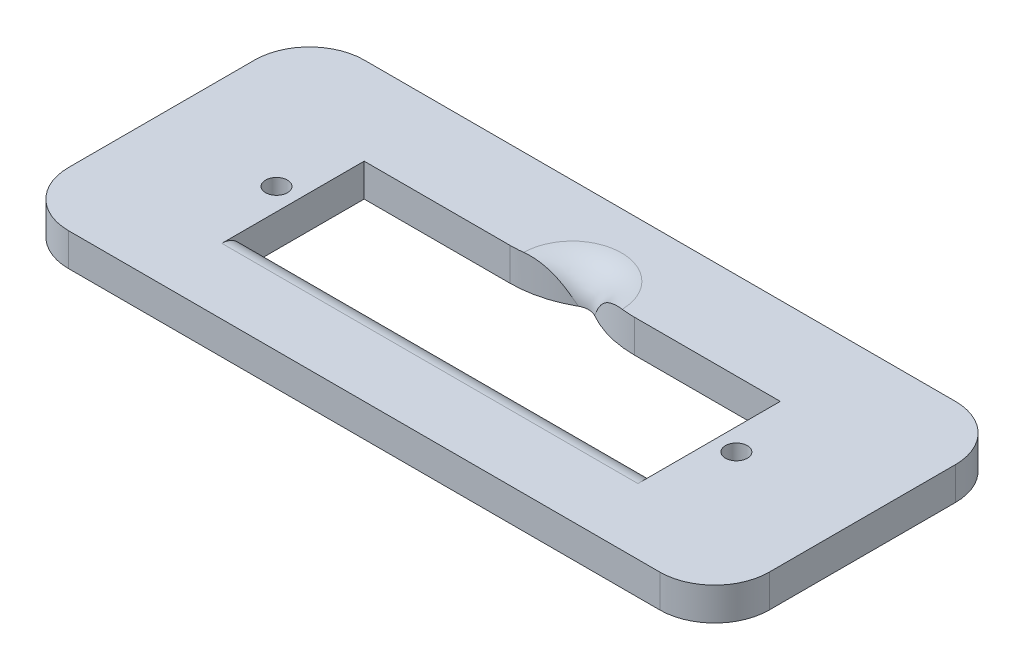
ISO-10303-21;
HEADER;
FILE_DESCRIPTION(('STEP AP214'),'2;1');
FILE_NAME('part.step','',(''),(''),'','','');
FILE_SCHEMA(('AUTOMOTIVE_DESIGN { 1 0 10303 214 1 1 1 1 }'));
ENDSEC;
DATA;
#1=APPLICATION_CONTEXT('core data for automotive mechanical design processes');
#2=APPLICATION_PROTOCOL_DEFINITION('international standard','automotive_design',2000,#1);
#3=PRODUCT_CONTEXT('',#1,'mechanical');
#4=PRODUCT('Part','Part','',(#3));
#5=PRODUCT_RELATED_PRODUCT_CATEGORY('part','',(#4));
#6=PRODUCT_DEFINITION_FORMATION('','',#4);
#7=PRODUCT_DEFINITION_CONTEXT('part definition',#1,'design');
#8=PRODUCT_DEFINITION('design','',#6,#7);
#9=PRODUCT_DEFINITION_SHAPE('','',#8);
#10=(LENGTH_UNIT() NAMED_UNIT(*) SI_UNIT(.MILLI.,.METRE.));
#11=(NAMED_UNIT(*) PLANE_ANGLE_UNIT() SI_UNIT($,.RADIAN.));
#12=(NAMED_UNIT(*) SI_UNIT($,.STERADIAN.) SOLID_ANGLE_UNIT());
#13=UNCERTAINTY_MEASURE_WITH_UNIT(LENGTH_MEASURE(1.E-05),#10,'distance_accuracy_value','');
#14=(GEOMETRIC_REPRESENTATION_CONTEXT(3) GLOBAL_UNCERTAINTY_ASSIGNED_CONTEXT((#13)) GLOBAL_UNIT_ASSIGNED_CONTEXT((#10,
#11,#12)) REPRESENTATION_CONTEXT('',''));
#15=CARTESIAN_POINT('',(0.,0.,0.));
#16=DIRECTION('',(0.,0.,1.));
#17=DIRECTION('',(1.,0.,0.));
#18=AXIS2_PLACEMENT_3D('',#15,#16,#17);
#19=CARTESIAN_POINT('',(-19.,3.,-5.5));
#20=DIRECTION('',(0.,0.,1.));
#21=DIRECTION('',(1.,0.,0.));
#22=AXIS2_PLACEMENT_3D('',#19,#20,#21);
#23=PLANE('',#22);
#24=DIRECTION('',(-1.,0.,0.));
#25=VECTOR('',#24,1.);
#26=CARTESIAN_POINT('',(-19.,3.,-5.5));
#27=LINE('',#26,#25);
#28=CARTESIAN_POINT('',(19.,3.,-5.5));
#29=VERTEX_POINT('',#28);
#30=CARTESIAN_POINT('',(5.67890834580027,3.,-5.5));
#31=VERTEX_POINT('',#30);
#32=EDGE_CURVE('E170',#29,#31,#27,.T.);
#33=ORIENTED_EDGE('',*,*,#32,.T.);
#34=DIRECTION('',(0.,-1.,0.));
#35=VECTOR('',#34,1.);
#36=CARTESIAN_POINT('',(5.67890834580027,0.,-5.5));
#37=LINE('',#36,#35);
#38=CARTESIAN_POINT('',(5.67890834580027,0.,-5.5));
#39=VERTEX_POINT('',#38);
#40=EDGE_CURVE('E299',#31,#39,#37,.T.);
#41=ORIENTED_EDGE('',*,*,#40,.T.);
#42=DIRECTION('',(-1.,0.,0.));
#43=VECTOR('',#42,1.);
#44=CARTESIAN_POINT('',(-19.,0.,-5.5));
#45=LINE('',#44,#43);
#46=CARTESIAN_POINT('',(19.,0.,-5.5));
#47=VERTEX_POINT('',#46);
#48=EDGE_CURVE('E173',#47,#39,#45,.T.);
#49=ORIENTED_EDGE('',*,*,#48,.F.);
#50=DIRECTION('',(0.,-1.,0.));
#51=VECTOR('',#50,1.);
#52=CARTESIAN_POINT('',(19.,3.,-5.5));
#53=LINE('',#52,#51);
#54=EDGE_CURVE('E160',#29,#47,#53,.T.);
#55=ORIENTED_EDGE('',*,*,#54,.F.);
#56=EDGE_LOOP('',(#33,#41,#49,#55));
#57=FACE_BOUND('',#56,.T.);
#58=ADVANCED_FACE('F38',(#57),#23,.T.);
#59=CARTESIAN_POINT('',(27.,3.,-8.5));
#60=DIRECTION('',(0.,1.,0.));
#61=DIRECTION('',(0.,0.,1.));
#62=AXIS2_PLACEMENT_3D('',#59,#60,#61);
#63=PLANE('',#62);
#64=DIRECTION('',(0.,0.,-1.));
#65=VECTOR('',#64,1.);
#66=CARTESIAN_POINT('',(19.,3.,-5.5));
#67=LINE('',#66,#65);
#68=CARTESIAN_POINT('',(19.,3.,7.5));
#69=VERTEX_POINT('',#68);
#70=EDGE_CURVE('E54',#69,#29,#67,.T.);
#71=ORIENTED_EDGE('',*,*,#70,.F.);
#72=DIRECTION('',(1.,0.,0.));
#73=VECTOR('',#72,1.);
#74=CARTESIAN_POINT('',(27.,3.,7.5));
#75=LINE('',#74,#73);
#76=CARTESIAN_POINT('',(-19.,3.,7.5));
#77=VERTEX_POINT('',#76);
#78=EDGE_CURVE('E348',#69,#77,#75,.F.);
#79=ORIENTED_EDGE('',*,*,#78,.T.);
#80=DIRECTION('',(0.,0.,1.));
#81=VECTOR('',#80,1.);
#82=CARTESIAN_POINT('',(-19.,3.,-5.5));
#83=LINE('',#82,#81);
#84=CARTESIAN_POINT('',(-19.,3.,-5.5));
#85=VERTEX_POINT('',#84);
#86=EDGE_CURVE('E61',#85,#77,#83,.T.);
#87=ORIENTED_EDGE('',*,*,#86,.F.);
#88=CARTESIAN_POINT('',(-5.67890834580028,3.,-5.5));
#89=VERTEX_POINT('',#88);
#90=EDGE_CURVE('E165',#89,#85,#27,.T.);
#91=ORIENTED_EDGE('',*,*,#90,.F.);
#92=CARTESIAN_POINT('',(-5.67890834580028,3.,-15.5));
#93=DIRECTION('',(0.,1.,0.));
#94=DIRECTION('',(0.,0.,1.));
#95=AXIS2_PLACEMENT_3D('',#92,#93,#94);
#96=CIRCLE('',#95,10.);
#97=CARTESIAN_POINT('',(-4.49945865025945,3.,-5.56979867194584));
#98=VERTEX_POINT('',#97);
#99=EDGE_CURVE('E293',#89,#98,#96,.T.);
#100=ORIENTED_EDGE('',*,*,#99,.T.);
#101=CARTESIAN_POINT('',(0.,3.,-5.5));
#102=DIRECTION('',(0.,1.,0.));
#103=DIRECTION('',(0.,0.,1.));
#104=AXIS2_PLACEMENT_3D('',#101,#102,#103);
#105=CIRCLE('',#104,4.5);
#106=CARTESIAN_POINT('',(4.49945865025945,3.,-5.56979867194584));
#107=VERTEX_POINT('',#106);
#108=EDGE_CURVE('E320',#98,#107,#105,.F.);
#109=ORIENTED_EDGE('',*,*,#108,.T.);
#110=CARTESIAN_POINT('',(5.67890834580027,3.,-15.5));
#111=DIRECTION('',(0.,1.,0.));
#112=DIRECTION('',(0.,0.,1.));
#113=AXIS2_PLACEMENT_3D('',#110,#111,#112);
#114=CIRCLE('',#113,10.);
#115=EDGE_CURVE('E181',#107,#31,#114,.T.);
#116=ORIENTED_EDGE('',*,*,#115,.T.);
#117=ORIENTED_EDGE('',*,*,#32,.F.);
#118=EDGE_LOOP('',(#71,#79,#87,#91,#100,#109,#116,#117));
#119=FACE_BOUND('',#118,.T.);
#120=CARTESIAN_POINT('',(20.994046775217,3.,0.5));
#121=DIRECTION('',(0.,1.,0.));
#122=DIRECTION('',(0.,0.,1.));
#123=AXIS2_PLACEMENT_3D('',#120,#121,#122);
#124=CIRCLE('',#123,1.);
#125=CARTESIAN_POINT('',(20.994046775217,3.,1.5));
#126=VERTEX_POINT('',#125);
#127=EDGE_CURVE('E194',#126,#126,#124,.T.);
#128=ORIENTED_EDGE('',*,*,#127,.F.);
#129=EDGE_LOOP('',(#128));
#130=FACE_BOUND('',#129,.T.);
#131=CARTESIAN_POINT('',(27.,3.,-8.5));
#132=DIRECTION('',(0.,1.,0.));
#133=DIRECTION('',(0.,0.,1.));
#134=AXIS2_PLACEMENT_3D('',#131,#132,#133);
#135=CIRCLE('',#134,5.);
#136=CARTESIAN_POINT('',(32.,3.,-8.5));
#137=VERTEX_POINT('',#136);
#138=CARTESIAN_POINT('',(27.,3.,-13.5));
#139=VERTEX_POINT('',#138);
#140=EDGE_CURVE('E212',#137,#139,#135,.T.);
#141=ORIENTED_EDGE('',*,*,#140,.T.);
#142=DIRECTION('',(-1.,0.,0.));
#143=VECTOR('',#142,1.);
#144=CARTESIAN_POINT('',(-27.,3.,-13.5));
#145=LINE('',#144,#143);
#146=CARTESIAN_POINT('',(-27.,3.,-13.5));
#147=VERTEX_POINT('',#146);
#148=EDGE_CURVE('E216',#139,#147,#145,.T.);
#149=ORIENTED_EDGE('',*,*,#148,.T.);
#150=CARTESIAN_POINT('',(-27.,3.,-8.5));
#151=DIRECTION('',(0.,1.,0.));
#152=DIRECTION('',(0.,0.,-1.));
#153=AXIS2_PLACEMENT_3D('',#150,#151,#152);
#154=CIRCLE('',#153,5.);
#155=CARTESIAN_POINT('',(-32.,3.,-8.5));
#156=VERTEX_POINT('',#155);
#157=EDGE_CURVE('E220',#147,#156,#154,.T.);
#158=ORIENTED_EDGE('',*,*,#157,.T.);
#159=DIRECTION('',(0.,0.,1.));
#160=VECTOR('',#159,1.);
#161=CARTESIAN_POINT('',(-32.,3.,-8.5));
#162=LINE('',#161,#160);
#163=CARTESIAN_POINT('',(-32.,3.,8.5));
#164=VERTEX_POINT('',#163);
#165=EDGE_CURVE('E223',#156,#164,#162,.T.);
#166=ORIENTED_EDGE('',*,*,#165,.T.);
#167=CARTESIAN_POINT('',(-27.,3.,8.5));
#168=DIRECTION('',(0.,1.,0.));
#169=DIRECTION('',(0.,0.,1.));
#170=AXIS2_PLACEMENT_3D('',#167,#168,#169);
#171=CIRCLE('',#170,5.);
#172=CARTESIAN_POINT('',(-27.,3.,13.5));
#173=VERTEX_POINT('',#172);
#174=EDGE_CURVE('E226',#164,#173,#171,.T.);
#175=ORIENTED_EDGE('',*,*,#174,.T.);
#176=DIRECTION('',(1.,0.,0.));
#177=VECTOR('',#176,1.);
#178=CARTESIAN_POINT('',(-27.,3.,13.5));
#179=LINE('',#178,#177);
#180=CARTESIAN_POINT('',(27.,3.,13.5));
#181=VERTEX_POINT('',#180);
#182=EDGE_CURVE('E229',#173,#181,#179,.T.);
#183=ORIENTED_EDGE('',*,*,#182,.T.);
#184=CARTESIAN_POINT('',(27.,3.,8.5));
#185=DIRECTION('',(0.,1.,0.));
#186=DIRECTION('',(0.,0.,1.));
#187=AXIS2_PLACEMENT_3D('',#184,#185,#186);
#188=CIRCLE('',#187,5.);
#189=CARTESIAN_POINT('',(32.,3.,8.5));
#190=VERTEX_POINT('',#189);
#191=EDGE_CURVE('E232',#181,#190,#188,.T.);
#192=ORIENTED_EDGE('',*,*,#191,.T.);
#193=DIRECTION('',(0.,0.,-1.));
#194=VECTOR('',#193,1.);
#195=CARTESIAN_POINT('',(32.,3.,-8.5));
#196=LINE('',#195,#194);
#197=EDGE_CURVE('E235',#190,#137,#196,.T.);
#198=ORIENTED_EDGE('',*,*,#197,.T.);
#199=EDGE_LOOP('',(#141,#149,#158,#166,#175,#183,#192,#198));
#200=FACE_BOUND('',#199,.T.);
#201=CARTESIAN_POINT('',(-21.005953224783,3.,0.5));
#202=DIRECTION('',(0.,1.,0.));
#203=DIRECTION('',(0.,0.,1.));
#204=AXIS2_PLACEMENT_3D('',#201,#202,#203);
#205=CIRCLE('',#204,1.);
#206=CARTESIAN_POINT('',(-21.005953224783,3.,1.5));
#207=VERTEX_POINT('',#206);
#208=EDGE_CURVE('E368',#207,#207,#205,.T.);
#209=ORIENTED_EDGE('',*,*,#208,.F.);
#210=EDGE_LOOP('',(#209));
#211=FACE_BOUND('',#210,.T.);
#212=ADVANCED_FACE('F178',(#119,#130,#200,#211),#63,.T.);
#213=CARTESIAN_POINT('',(27.,0.,-8.5));
#214=DIRECTION('',(0.,1.,0.));
#215=DIRECTION('',(0.,0.,1.));
#216=AXIS2_PLACEMENT_3D('',#213,#214,#215);
#217=PLANE('',#216);
#218=CARTESIAN_POINT('',(27.,0.,-8.5));
#219=DIRECTION('',(0.,1.,0.));
#220=DIRECTION('',(0.,0.,1.));
#221=AXIS2_PLACEMENT_3D('',#218,#219,#220);
#222=CIRCLE('',#221,5.);
#223=CARTESIAN_POINT('',(32.,0.,-8.5));
#224=VERTEX_POINT('',#223);
#225=CARTESIAN_POINT('',(27.,0.,-13.5));
#226=VERTEX_POINT('',#225);
#227=EDGE_CURVE('E175',#224,#226,#222,.T.);
#228=ORIENTED_EDGE('',*,*,#227,.F.);
#229=DIRECTION('',(0.,0.,-1.));
#230=VECTOR('',#229,1.);
#231=CARTESIAN_POINT('',(32.,0.,-8.5));
#232=LINE('',#231,#230);
#233=CARTESIAN_POINT('',(32.,0.,8.5));
#234=VERTEX_POINT('',#233);
#235=EDGE_CURVE('E217',#234,#224,#232,.T.);
#236=ORIENTED_EDGE('',*,*,#235,.F.);
#237=CARTESIAN_POINT('',(27.,0.,8.5));
#238=DIRECTION('',(0.,1.,0.));
#239=DIRECTION('',(0.,0.,1.));
#240=AXIS2_PLACEMENT_3D('',#237,#238,#239);
#241=CIRCLE('',#240,5.);
#242=CARTESIAN_POINT('',(27.,0.,13.5));
#243=VERTEX_POINT('',#242);
#244=EDGE_CURVE('E257',#243,#234,#241,.T.);
#245=ORIENTED_EDGE('',*,*,#244,.F.);
#246=DIRECTION('',(1.,0.,0.));
#247=VECTOR('',#246,1.);
#248=CARTESIAN_POINT('',(-27.,0.,13.5));
#249=LINE('',#248,#247);
#250=CARTESIAN_POINT('',(-27.,0.,13.5));
#251=VERTEX_POINT('',#250);
#252=EDGE_CURVE('E254',#251,#243,#249,.T.);
#253=ORIENTED_EDGE('',*,*,#252,.F.);
#254=CARTESIAN_POINT('',(-27.,0.,8.5));
#255=DIRECTION('',(0.,1.,0.));
#256=DIRECTION('',(0.,0.,1.));
#257=AXIS2_PLACEMENT_3D('',#254,#255,#256);
#258=CIRCLE('',#257,5.);
#259=CARTESIAN_POINT('',(-32.,0.,8.5));
#260=VERTEX_POINT('',#259);
#261=EDGE_CURVE('E251',#260,#251,#258,.T.);
#262=ORIENTED_EDGE('',*,*,#261,.F.);
#263=DIRECTION('',(0.,0.,1.));
#264=VECTOR('',#263,1.);
#265=CARTESIAN_POINT('',(-32.,0.,-8.5));
#266=LINE('',#265,#264);
#267=CARTESIAN_POINT('',(-32.,0.,-8.5));
#268=VERTEX_POINT('',#267);
#269=EDGE_CURVE('E248',#268,#260,#266,.T.);
#270=ORIENTED_EDGE('',*,*,#269,.F.);
#271=CARTESIAN_POINT('',(-27.,0.,-8.5));
#272=DIRECTION('',(0.,1.,0.));
#273=DIRECTION('',(0.,0.,-1.));
#274=AXIS2_PLACEMENT_3D('',#271,#272,#273);
#275=CIRCLE('',#274,5.);
#276=CARTESIAN_POINT('',(-27.,0.,-13.5));
#277=VERTEX_POINT('',#276);
#278=EDGE_CURVE('E245',#277,#268,#275,.T.);
#279=ORIENTED_EDGE('',*,*,#278,.F.);
#280=DIRECTION('',(-1.,0.,0.));
#281=VECTOR('',#280,1.);
#282=CARTESIAN_POINT('',(-27.,0.,-13.5));
#283=LINE('',#282,#281);
#284=EDGE_CURVE('E242',#226,#277,#283,.T.);
#285=ORIENTED_EDGE('',*,*,#284,.F.);
#286=EDGE_LOOP('',(#228,#236,#245,#253,#262,#270,#279,#285));
#287=FACE_BOUND('',#286,.T.);
#288=ORIENTED_EDGE('',*,*,#48,.T.);
#289=CARTESIAN_POINT('',(5.67890834580027,0.,-15.5));
#290=DIRECTION('',(0.,1.,0.));
#291=DIRECTION('',(0.,0.,1.));
#292=AXIS2_PLACEMENT_3D('',#289,#290,#291);
#293=CIRCLE('',#292,10.);
#294=CARTESIAN_POINT('',(0.740727175539163,0.,-6.80434782608696));
#295=VERTEX_POINT('',#294);
#296=EDGE_CURVE('E305',#39,#295,#293,.F.);
#297=ORIENTED_EDGE('',*,*,#296,.T.);
#298=CARTESIAN_POINT('',(0.,0.,-5.5));
#299=DIRECTION('',(0.,1.,0.));
#300=DIRECTION('',(0.,0.,1.));
#301=AXIS2_PLACEMENT_3D('',#298,#299,#300);
#302=CIRCLE('',#301,1.5);
#303=CARTESIAN_POINT('',(-0.74072717553917,0.,-6.80434782608696));
#304=VERTEX_POINT('',#303);
#305=EDGE_CURVE('E360',#295,#304,#302,.T.);
#306=ORIENTED_EDGE('',*,*,#305,.T.);
#307=CARTESIAN_POINT('',(-5.67890834580028,0.,-15.5));
#308=DIRECTION('',(0.,1.,0.));
#309=DIRECTION('',(0.,0.,1.));
#310=AXIS2_PLACEMENT_3D('',#307,#308,#309);
#311=CIRCLE('',#310,10.);
#312=CARTESIAN_POINT('',(-5.67890834580028,0.,-5.5));
#313=VERTEX_POINT('',#312);
#314=EDGE_CURVE('E302',#304,#313,#311,.F.);
#315=ORIENTED_EDGE('',*,*,#314,.T.);
#316=CARTESIAN_POINT('',(-19.,0.,-5.5));
#317=VERTEX_POINT('',#316);
#318=EDGE_CURVE('E193',#313,#317,#45,.T.);
#319=ORIENTED_EDGE('',*,*,#318,.T.);
#320=DIRECTION('',(0.,0.,1.));
#321=VECTOR('',#320,1.);
#322=CARTESIAN_POINT('',(-19.,0.,-5.5));
#323=LINE('',#322,#321);
#324=CARTESIAN_POINT('',(-19.,0.,5.5));
#325=VERTEX_POINT('',#324);
#326=EDGE_CURVE('E197',#317,#325,#323,.T.);
#327=ORIENTED_EDGE('',*,*,#326,.T.);
#328=DIRECTION('',(1.,0.,0.));
#329=VECTOR('',#328,1.);
#330=CARTESIAN_POINT('',(-19.,0.,5.5));
#331=LINE('',#330,#329);
#332=CARTESIAN_POINT('',(19.,0.,5.5));
#333=VERTEX_POINT('',#332);
#334=EDGE_CURVE('E166',#325,#333,#331,.T.);
#335=ORIENTED_EDGE('',*,*,#334,.T.);
#336=DIRECTION('',(0.,0.,-1.));
#337=VECTOR('',#336,1.);
#338=CARTESIAN_POINT('',(19.,0.,-5.5));
#339=LINE('',#338,#337);
#340=EDGE_CURVE('E190',#333,#47,#339,.T.);
#341=ORIENTED_EDGE('',*,*,#340,.T.);
#342=EDGE_LOOP('',(#288,#297,#306,#315,#319,#327,#335,#341));
#343=FACE_BOUND('',#342,.T.);
#344=CARTESIAN_POINT('',(20.994046775217,0.,0.5));
#345=DIRECTION('',(0.,1.,0.));
#346=DIRECTION('',(0.,0.,1.));
#347=AXIS2_PLACEMENT_3D('',#344,#345,#346);
#348=CIRCLE('',#347,1.);
#349=CARTESIAN_POINT('',(20.994046775217,0.,1.5));
#350=VERTEX_POINT('',#349);
#351=EDGE_CURVE('E373',#350,#350,#348,.T.);
#352=ORIENTED_EDGE('',*,*,#351,.T.);
#353=EDGE_LOOP('',(#352));
#354=FACE_BOUND('',#353,.T.);
#355=CARTESIAN_POINT('',(-21.005953224783,0.,0.5));
#356=DIRECTION('',(0.,1.,0.));
#357=DIRECTION('',(0.,0.,1.));
#358=AXIS2_PLACEMENT_3D('',#355,#356,#357);
#359=CIRCLE('',#358,1.);
#360=CARTESIAN_POINT('',(-21.005953224783,0.,1.5));
#361=VERTEX_POINT('',#360);
#362=EDGE_CURVE('E364',#361,#361,#359,.T.);
#363=ORIENTED_EDGE('',*,*,#362,.T.);
#364=EDGE_LOOP('',(#363));
#365=FACE_BOUND('',#364,.T.);
#366=ADVANCED_FACE('F381',(#287,#343,#354,#365),#217,.F.);
#367=CARTESIAN_POINT('',(27.,3.,-8.5));
#368=DIRECTION('',(0.,-1.,0.));
#369=DIRECTION('',(0.,0.,-1.));
#370=AXIS2_PLACEMENT_3D('',#367,#368,#369);
#371=CYLINDRICAL_SURFACE('',#370,5.);
#372=ORIENTED_EDGE('',*,*,#227,.T.);
#373=DIRECTION('',(0.,-1.,0.));
#374=VECTOR('',#373,1.);
#375=CARTESIAN_POINT('',(27.,3.,-13.5));
#376=LINE('',#375,#374);
#377=EDGE_CURVE('E289',#139,#226,#376,.T.);
#378=ORIENTED_EDGE('',*,*,#377,.F.);
#379=ORIENTED_EDGE('',*,*,#140,.F.);
#380=DIRECTION('',(0.,-1.,0.));
#381=VECTOR('',#380,1.);
#382=CARTESIAN_POINT('',(32.,3.,-8.5));
#383=LINE('',#382,#381);
#384=EDGE_CURVE('E238',#137,#224,#383,.T.);
#385=ORIENTED_EDGE('',*,*,#384,.T.);
#386=EDGE_LOOP('',(#372,#378,#379,#385));
#387=FACE_BOUND('',#386,.T.);
#388=ADVANCED_FACE('F335',(#387),#371,.T.);
#389=CARTESIAN_POINT('',(-27.,3.,-13.5));
#390=DIRECTION('',(0.,0.,1.));
#391=DIRECTION('',(1.,0.,0.));
#392=AXIS2_PLACEMENT_3D('',#389,#390,#391);
#393=PLANE('',#392);
#394=ORIENTED_EDGE('',*,*,#284,.T.);
#395=DIRECTION('',(0.,-1.,0.));
#396=VECTOR('',#395,1.);
#397=CARTESIAN_POINT('',(-27.,3.,-13.5));
#398=LINE('',#397,#396);
#399=EDGE_CURVE('E285',#147,#277,#398,.T.);
#400=ORIENTED_EDGE('',*,*,#399,.F.);
#401=ORIENTED_EDGE('',*,*,#148,.F.);
#402=ORIENTED_EDGE('',*,*,#377,.T.);
#403=EDGE_LOOP('',(#394,#400,#401,#402));
#404=FACE_BOUND('',#403,.T.);
#405=ADVANCED_FACE('F428',(#404),#393,.F.);
#406=CARTESIAN_POINT('',(-27.,3.,-8.5));
#407=DIRECTION('',(0.,-1.,0.));
#408=DIRECTION('',(0.,0.,-1.));
#409=AXIS2_PLACEMENT_3D('',#406,#407,#408);
#410=CYLINDRICAL_SURFACE('',#409,5.);
#411=ORIENTED_EDGE('',*,*,#278,.T.);
#412=DIRECTION('',(0.,-1.,0.));
#413=VECTOR('',#412,1.);
#414=CARTESIAN_POINT('',(-32.,3.,-8.5));
#415=LINE('',#414,#413);
#416=EDGE_CURVE('E281',#156,#268,#415,.T.);
#417=ORIENTED_EDGE('',*,*,#416,.F.);
#418=ORIENTED_EDGE('',*,*,#157,.F.);
#419=ORIENTED_EDGE('',*,*,#399,.T.);
#420=EDGE_LOOP('',(#411,#417,#418,#419));
#421=FACE_BOUND('',#420,.T.);
#422=ADVANCED_FACE('F450',(#421),#410,.T.);
#423=CARTESIAN_POINT('',(-32.,3.,-8.5));
#424=DIRECTION('',(1.,0.,0.));
#425=DIRECTION('',(0.,0.,-1.));
#426=AXIS2_PLACEMENT_3D('',#423,#424,#425);
#427=PLANE('',#426);
#428=ORIENTED_EDGE('',*,*,#269,.T.);
#429=DIRECTION('',(0.,-1.,0.));
#430=VECTOR('',#429,1.);
#431=CARTESIAN_POINT('',(-32.,3.,8.5));
#432=LINE('',#431,#430);
#433=EDGE_CURVE('E277',#164,#260,#432,.T.);
#434=ORIENTED_EDGE('',*,*,#433,.F.);
#435=ORIENTED_EDGE('',*,*,#165,.F.);
#436=ORIENTED_EDGE('',*,*,#416,.T.);
#437=EDGE_LOOP('',(#428,#434,#435,#436));
#438=FACE_BOUND('',#437,.T.);
#439=ADVANCED_FACE('F446',(#438),#427,.F.);
#440=CARTESIAN_POINT('',(-27.,3.,8.5));
#441=DIRECTION('',(0.,-1.,0.));
#442=DIRECTION('',(0.,0.,-1.));
#443=AXIS2_PLACEMENT_3D('',#440,#441,#442);
#444=CYLINDRICAL_SURFACE('',#443,5.);
#445=ORIENTED_EDGE('',*,*,#261,.T.);
#446=DIRECTION('',(0.,-1.,0.));
#447=VECTOR('',#446,1.);
#448=CARTESIAN_POINT('',(-27.,3.,13.5));
#449=LINE('',#448,#447);
#450=EDGE_CURVE('E273',#173,#251,#449,.T.);
#451=ORIENTED_EDGE('',*,*,#450,.F.);
#452=ORIENTED_EDGE('',*,*,#174,.F.);
#453=ORIENTED_EDGE('',*,*,#433,.T.);
#454=EDGE_LOOP('',(#445,#451,#452,#453));
#455=FACE_BOUND('',#454,.T.);
#456=ADVANCED_FACE('F442',(#455),#444,.T.);
#457=CARTESIAN_POINT('',(-27.,3.,13.5));
#458=DIRECTION('',(0.,0.,-1.));
#459=DIRECTION('',(-1.,0.,0.));
#460=AXIS2_PLACEMENT_3D('',#457,#458,#459);
#461=PLANE('',#460);
#462=ORIENTED_EDGE('',*,*,#252,.T.);
#463=DIRECTION('',(0.,-1.,0.));
#464=VECTOR('',#463,1.);
#465=CARTESIAN_POINT('',(27.,3.,13.5));
#466=LINE('',#465,#464);
#467=EDGE_CURVE('E269',#181,#243,#466,.T.);
#468=ORIENTED_EDGE('',*,*,#467,.F.);
#469=ORIENTED_EDGE('',*,*,#182,.F.);
#470=ORIENTED_EDGE('',*,*,#450,.T.);
#471=EDGE_LOOP('',(#462,#468,#469,#470));
#472=FACE_BOUND('',#471,.T.);
#473=ADVANCED_FACE('F438',(#472),#461,.F.);
#474=CARTESIAN_POINT('',(27.,3.,8.5));
#475=DIRECTION('',(0.,-1.,0.));
#476=DIRECTION('',(0.,0.,-1.));
#477=AXIS2_PLACEMENT_3D('',#474,#475,#476);
#478=CYLINDRICAL_SURFACE('',#477,5.);
#479=ORIENTED_EDGE('',*,*,#244,.T.);
#480=DIRECTION('',(0.,-1.,0.));
#481=VECTOR('',#480,1.);
#482=CARTESIAN_POINT('',(32.,3.,8.5));
#483=LINE('',#482,#481);
#484=EDGE_CURVE('E265',#190,#234,#483,.T.);
#485=ORIENTED_EDGE('',*,*,#484,.F.);
#486=ORIENTED_EDGE('',*,*,#191,.F.);
#487=ORIENTED_EDGE('',*,*,#467,.T.);
#488=EDGE_LOOP('',(#479,#485,#486,#487));
#489=FACE_BOUND('',#488,.T.);
#490=ADVANCED_FACE('F434',(#489),#478,.T.);
#491=CARTESIAN_POINT('',(32.,3.,-8.5));
#492=DIRECTION('',(-1.,0.,0.));
#493=DIRECTION('',(0.,0.,1.));
#494=AXIS2_PLACEMENT_3D('',#491,#492,#493);
#495=PLANE('',#494);
#496=ORIENTED_EDGE('',*,*,#235,.T.);
#497=ORIENTED_EDGE('',*,*,#384,.F.);
#498=ORIENTED_EDGE('',*,*,#197,.F.);
#499=ORIENTED_EDGE('',*,*,#484,.T.);
#500=EDGE_LOOP('',(#496,#497,#498,#499));
#501=FACE_BOUND('',#500,.T.);
#502=ADVANCED_FACE('F417',(#501),#495,.F.);
#503=CARTESIAN_POINT('',(19.,3.,-5.5));
#504=DIRECTION('',(-1.,0.,0.));
#505=DIRECTION('',(0.,0.,1.));
#506=AXIS2_PLACEMENT_3D('',#503,#504,#505);
#507=PLANE('',#506);
#508=ORIENTED_EDGE('',*,*,#340,.F.);
#509=DIRECTION('',(0.,-1.,0.));
#510=VECTOR('',#509,1.);
#511=CARTESIAN_POINT('',(19.,3.,5.5));
#512=LINE('',#511,#510);
#513=CARTESIAN_POINT('',(19.,1.,5.5));
#514=VERTEX_POINT('',#513);
#515=EDGE_CURVE('E186',#514,#333,#512,.T.);
#516=ORIENTED_EDGE('',*,*,#515,.F.);
#517=CARTESIAN_POINT('',(19.,1.,7.5));
#518=DIRECTION('',(-1.,0.,0.));
#519=DIRECTION('',(0.,0.,1.));
#520=AXIS2_PLACEMENT_3D('',#517,#518,#519);
#521=CIRCLE('',#520,2.);
#522=EDGE_CURVE('E47',#514,#69,#521,.F.);
#523=ORIENTED_EDGE('',*,*,#522,.T.);
#524=ORIENTED_EDGE('',*,*,#70,.T.);
#525=ORIENTED_EDGE('',*,*,#54,.T.);
#526=EDGE_LOOP('',(#508,#516,#523,#524,#525));
#527=FACE_BOUND('',#526,.T.);
#528=ADVANCED_FACE('F159',(#527),#507,.T.);
#529=ORIENTED_EDGE('',*,*,#318,.F.);
#530=DIRECTION('',(0.,-1.,0.));
#531=VECTOR('',#530,1.);
#532=CARTESIAN_POINT('',(-5.67890834580028,3.,-5.5));
#533=LINE('',#532,#531);
#534=EDGE_CURVE('E309',#313,#89,#533,.F.);
#535=ORIENTED_EDGE('',*,*,#534,.T.);
#536=ORIENTED_EDGE('',*,*,#90,.T.);
#537=DIRECTION('',(0.,-1.,0.));
#538=VECTOR('',#537,1.);
#539=CARTESIAN_POINT('',(-19.,3.,-5.5));
#540=LINE('',#539,#538);
#541=EDGE_CURVE('E176',#85,#317,#540,.T.);
#542=ORIENTED_EDGE('',*,*,#541,.T.);
#543=EDGE_LOOP('',(#529,#535,#536,#542));
#544=FACE_BOUND('',#543,.T.);
#545=ADVANCED_FACE('F401',(#544),#23,.T.);
#546=CARTESIAN_POINT('',(-19.,3.,-5.5));
#547=DIRECTION('',(1.,0.,0.));
#548=DIRECTION('',(0.,0.,-1.));
#549=AXIS2_PLACEMENT_3D('',#546,#547,#548);
#550=PLANE('',#549);
#551=ORIENTED_EDGE('',*,*,#326,.F.);
#552=ORIENTED_EDGE('',*,*,#541,.F.);
#553=ORIENTED_EDGE('',*,*,#86,.T.);
#554=CARTESIAN_POINT('',(-19.,1.,7.5));
#555=DIRECTION('',(1.,0.,0.));
#556=DIRECTION('',(0.,0.,-1.));
#557=AXIS2_PLACEMENT_3D('',#554,#555,#556);
#558=CIRCLE('',#557,2.);
#559=CARTESIAN_POINT('',(-19.,1.,5.5));
#560=VERTEX_POINT('',#559);
#561=EDGE_CURVE('E11',#77,#560,#558,.F.);
#562=ORIENTED_EDGE('',*,*,#561,.T.);
#563=DIRECTION('',(0.,-1.,0.));
#564=VECTOR('',#563,1.);
#565=CARTESIAN_POINT('',(-19.,3.,5.5));
#566=LINE('',#565,#564);
#567=EDGE_CURVE('E206',#560,#325,#566,.T.);
#568=ORIENTED_EDGE('',*,*,#567,.T.);
#569=EDGE_LOOP('',(#551,#552,#553,#562,#568));
#570=FACE_BOUND('',#569,.T.);
#571=ADVANCED_FACE('F396',(#570),#550,.T.);
#572=CARTESIAN_POINT('',(-19.,3.,5.5));
#573=DIRECTION('',(0.,0.,-1.));
#574=DIRECTION('',(-1.,0.,0.));
#575=AXIS2_PLACEMENT_3D('',#572,#573,#574);
#576=PLANE('',#575);
#577=ORIENTED_EDGE('',*,*,#567,.F.);
#578=DIRECTION('',(1.,0.,0.));
#579=VECTOR('',#578,1.);
#580=CARTESIAN_POINT('',(-19.,1.,5.5));
#581=LINE('',#580,#579);
#582=EDGE_CURVE('E344',#560,#514,#581,.T.);
#583=ORIENTED_EDGE('',*,*,#582,.T.);
#584=ORIENTED_EDGE('',*,*,#515,.T.);
#585=ORIENTED_EDGE('',*,*,#334,.F.);
#586=EDGE_LOOP('',(#577,#583,#584,#585));
#587=FACE_BOUND('',#586,.T.);
#588=ADVANCED_FACE('F386',(#587),#576,.T.);
#589=CARTESIAN_POINT('',(20.994046775217,3.,0.5));
#590=DIRECTION('',(0.,-1.,0.));
#591=DIRECTION('',(0.,0.,-1.));
#592=AXIS2_PLACEMENT_3D('',#589,#590,#591);
#593=CYLINDRICAL_SURFACE('',#592,1.);
#594=ORIENTED_EDGE('',*,*,#127,.T.);
#595=EDGE_LOOP('',(#594));
#596=FACE_BOUND('',#595,.T.);
#597=ORIENTED_EDGE('',*,*,#351,.F.);
#598=EDGE_LOOP('',(#597));
#599=FACE_BOUND('',#598,.T.);
#600=ADVANCED_FACE('F384',(#596,#599),#593,.F.);
#601=CARTESIAN_POINT('',(-21.005953224783,3.,0.5));
#602=DIRECTION('',(0.,-1.,0.));
#603=DIRECTION('',(0.,0.,-1.));
#604=AXIS2_PLACEMENT_3D('',#601,#602,#603);
#605=CYLINDRICAL_SURFACE('',#604,1.);
#606=ORIENTED_EDGE('',*,*,#208,.T.);
#607=EDGE_LOOP('',(#606));
#608=FACE_BOUND('',#607,.T.);
#609=ORIENTED_EDGE('',*,*,#362,.F.);
#610=EDGE_LOOP('',(#609));
#611=FACE_BOUND('',#610,.T.);
#612=ADVANCED_FACE('F333',(#608,#611),#605,.F.);
#613=CARTESIAN_POINT('',(5.67890834580027,0.,-15.5));
#614=DIRECTION('',(0.,1.,0.));
#615=DIRECTION('',(0.,0.,1.));
#616=AXIS2_PLACEMENT_3D('',#613,#614,#615);
#617=CYLINDRICAL_SURFACE('',#616,10.);
#618=ORIENTED_EDGE('',*,*,#115,.F.);
#619=CARTESIAN_POINT('',(4.49945865025945,3.,-5.56979867194584));
#620=CARTESIAN_POINT('',(4.40356140513263,3.00002384856333,-5.58117210213908));
#621=CARTESIAN_POINT('',(4.30786020366929,2.99542166209007,-5.59396371300794));
#622=CARTESIAN_POINT('',(4.11777322506243,2.97728950147037,-5.62214633913044));
#623=CARTESIAN_POINT('',(4.02338640848452,2.96376704542925,-5.63753515730746));
#624=CARTESIAN_POINT('',(3.83751375907686,2.92827541317904,-5.67054835103205));
#625=CARTESIAN_POINT('',(3.74600964046429,2.90638208266341,-5.68815172704688));
#626=CARTESIAN_POINT('',(3.56573087875088,2.85461605199342,-5.72539204396402));
#627=CARTESIAN_POINT('',(3.47695649675679,2.82474259114902,-5.74502917862102));
#628=CARTESIAN_POINT('',(3.23363035907066,2.7309004867798,-5.80225297720616));
#629=CARTESIAN_POINT('',(3.08265152922803,2.65866411356085,-5.84174087770162));
#630=CARTESIAN_POINT('',(2.79323003391131,2.49381428174562,-5.92421670879829));
#631=CARTESIAN_POINT('',(2.65480642337513,2.40117055822145,-5.96720977742017));
#632=CARTESIAN_POINT('',(2.41239628171842,2.21567877901805,-6.04783115305585));
#633=CARTESIAN_POINT('',(2.30644806048363,2.12524894839924,-6.08521330079563));
#634=CARTESIAN_POINT('',(2.10347504173139,1.93497142173315,-6.16040655235869));
#635=CARTESIAN_POINT('',(2.00645604641002,1.83511768620628,-6.19821791741224));
#636=CARTESIAN_POINT('',(1.82044025355334,1.62789263581671,-6.27382380033533));
#637=CARTESIAN_POINT('',(1.7314592830044,1.52050719861669,-6.31161814518037));
#638=CARTESIAN_POINT('',(1.5605796873868,1.30024071114621,-6.3869275478388));
#639=CARTESIAN_POINT('',(1.4786795344581,1.18736085468888,-6.4244426642979));
#640=CARTESIAN_POINT('',(1.34056623206275,0.986774123594042,-6.48983638585233));
#641=CARTESIAN_POINT('',(1.28309991119517,0.899930487139017,-6.51774976983876));
#642=CARTESIAN_POINT('',(1.17076552843081,0.724778292997776,-6.57360281751726));
#643=CARTESIAN_POINT('',(1.11589391725833,0.636471973489841,-6.60154238866123));
#644=CARTESIAN_POINT('',(0.953777174703609,0.369537720153074,-6.68591436297937));
#645=CARTESIAN_POINT('',(0.849331614658018,0.189348112574594,-6.74275606301183));
#646=CARTESIAN_POINT('',(0.744223259756042,0.00609685535232329,-6.80236314222866));
#647=CARTESIAN_POINT('',(0.742475068689345,0.00304842456875486,-6.80335522737601));
#648=CARTESIAN_POINT('',(0.740727175539163,0.,-6.80434782608696));
#649=B_SPLINE_CURVE_WITH_KNOTS('',3,(#619,#620,#621,#622,#623,#624,#625,#626,#627,#628,#629,
#630,#631,#632,#633,#634,#635,#636,#637,#638,#639,#640,#641,#642,#643,#644,#645,#646,#647,#648),
.UNSPECIFIED.,.F.,.F.,(4,2,2,2,2,2,2,2,2,2,2,2,2,2,4),(0.,0.289545884840962,0.57884804834757,
0.865588785022748,1.15235686444733,1.66618252898466,2.18077541062128,2.61279496783836,
3.04509329738727,3.47822507502788,3.91126315939367,4.23465217686043,4.55758521855277,
5.20513988469114,5.21609433599214),.UNSPECIFIED.);
#650=EDGE_CURVE('E337',#107,#295,#649,.T.);
#651=ORIENTED_EDGE('',*,*,#650,.T.);
#652=ORIENTED_EDGE('',*,*,#296,.F.);
#653=ORIENTED_EDGE('',*,*,#40,.F.);
#654=EDGE_LOOP('',(#618,#651,#652,#653));
#655=FACE_BOUND('',#654,.T.);
#656=ADVANCED_FACE('F328',(#655),#617,.T.);
#657=CARTESIAN_POINT('',(-5.67890834580028,0.,-15.5));
#658=DIRECTION('',(0.,1.,0.));
#659=DIRECTION('',(0.,0.,1.));
#660=AXIS2_PLACEMENT_3D('',#657,#658,#659);
#661=CYLINDRICAL_SURFACE('',#660,10.);
#662=ORIENTED_EDGE('',*,*,#314,.F.);
#663=CARTESIAN_POINT('',(-4.49945865025945,3.,-5.56979867194584));
#664=CARTESIAN_POINT('',(-4.40356140513264,3.00002384856333,-5.58117210213908));
#665=CARTESIAN_POINT('',(-4.3078602036693,2.99542166209007,-5.59396371300794));
#666=CARTESIAN_POINT('',(-4.11777322506244,2.97728950147037,-5.62214633913044));
#667=CARTESIAN_POINT('',(-4.02338640848452,2.96376704542925,-5.63753515730746));
#668=CARTESIAN_POINT('',(-3.83751375907687,2.92827541317904,-5.67054835103205));
#669=CARTESIAN_POINT('',(-3.7460096404643,2.90638208266341,-5.68815172704688));
#670=CARTESIAN_POINT('',(-3.56573087875088,2.85461605199342,-5.72539204396402));
#671=CARTESIAN_POINT('',(-3.4769564967568,2.82474259114902,-5.74502917862102));
#672=CARTESIAN_POINT('',(-3.23363035907066,2.7309004867798,-5.80225297720616));
#673=CARTESIAN_POINT('',(-3.08265152922804,2.65866411356085,-5.84174087770162));
#674=CARTESIAN_POINT('',(-2.79323003391132,2.49381428174562,-5.92421670879829));
#675=CARTESIAN_POINT('',(-2.65480642337513,2.40117055822145,-5.96720977742017));
#676=CARTESIAN_POINT('',(-2.41239628171843,2.21567877901805,-6.04783115305585));
#677=CARTESIAN_POINT('',(-2.30644806048364,2.12524894839924,-6.08521330079563));
#678=CARTESIAN_POINT('',(-2.1034750417314,1.93497142173315,-6.16040655235869));
#679=CARTESIAN_POINT('',(-2.00645604641002,1.83511768620628,-6.19821791741224));
#680=CARTESIAN_POINT('',(-1.82044025355334,1.62789263581671,-6.27382380033533));
#681=CARTESIAN_POINT('',(-1.73145928300441,1.52050719861669,-6.31161814518037));
#682=CARTESIAN_POINT('',(-1.56057968738681,1.30024071114621,-6.3869275478388));
#683=CARTESIAN_POINT('',(-1.47867953445811,1.18736085468888,-6.4244426642979));
#684=CARTESIAN_POINT('',(-1.34056623206276,0.986774123594042,-6.48983638585233));
#685=CARTESIAN_POINT('',(-1.28309991119518,0.899930487139017,-6.51774976983876));
#686=CARTESIAN_POINT('',(-1.17076552843082,0.724778292997776,-6.57360281751726));
#687=CARTESIAN_POINT('',(-1.11589391725834,0.636471973489841,-6.60154238866123));
#688=CARTESIAN_POINT('',(-0.953777174703616,0.369537720153074,-6.68591436297937));
#689=CARTESIAN_POINT('',(-0.849331614658025,0.189348112574594,-6.74275606301183));
#690=CARTESIAN_POINT('',(-0.744223259756049,0.00609685535232329,-6.80236314222866));
#691=CARTESIAN_POINT('',(-0.742475068689352,0.00304842456875486,-6.80335522737601));
#692=CARTESIAN_POINT('',(-0.74072717553917,0.,-6.80434782608696));
#693=B_SPLINE_CURVE_WITH_KNOTS('',3,(#663,#664,#665,#666,#667,#668,#669,#670,#671,#672,#673,
#674,#675,#676,#677,#678,#679,#680,#681,#682,#683,#684,#685,#686,#687,#688,#689,#690,#691,#692),
.UNSPECIFIED.,.F.,.F.,(4,2,2,2,2,2,2,2,2,2,2,2,2,2,4),(0.,0.289545884840962,0.57884804834757,
0.865588785022748,1.15235686444733,1.66618252898466,2.18077541062128,2.61279496783836,
3.04509329738727,3.47822507502788,3.91126315939367,4.23465217686043,4.55758521855277,
5.20513988469114,5.21609433599214),.UNSPECIFIED.);
#694=EDGE_CURVE('E312',#304,#98,#693,.F.);
#695=ORIENTED_EDGE('',*,*,#694,.T.);
#696=ORIENTED_EDGE('',*,*,#99,.F.);
#697=ORIENTED_EDGE('',*,*,#534,.F.);
#698=EDGE_LOOP('',(#662,#695,#696,#697));
#699=FACE_BOUND('',#698,.T.);
#700=ADVANCED_FACE('F324',(#699),#661,.T.);
#701=CARTESIAN_POINT('',(0.,0.,-5.5));
#702=DIRECTION('',(0.,1.,0.));
#703=DIRECTION('',(0.,0.,1.));
#704=AXIS2_PLACEMENT_3D('',#701,#702,#703);
#705=TOROIDAL_SURFACE('',#704,4.5,3.);
#706=ORIENTED_EDGE('',*,*,#650,.F.);
#707=ORIENTED_EDGE('',*,*,#108,.F.);
#708=ORIENTED_EDGE('',*,*,#694,.F.);
#709=ORIENTED_EDGE('',*,*,#305,.F.);
#710=EDGE_LOOP('',(#706,#707,#708,#709));
#711=FACE_BOUND('',#710,.T.);
#712=ADVANCED_FACE('F322',(#711),#705,.T.);
#713=CARTESIAN_POINT('',(-19.,1.,7.5));
#714=DIRECTION('',(1.,0.,0.));
#715=DIRECTION('',(0.,0.,-1.));
#716=AXIS2_PLACEMENT_3D('',#713,#714,#715);
#717=CYLINDRICAL_SURFACE('',#716,2.);
#718=ORIENTED_EDGE('',*,*,#561,.F.);
#719=ORIENTED_EDGE('',*,*,#78,.F.);
#720=ORIENTED_EDGE('',*,*,#522,.F.);
#721=ORIENTED_EDGE('',*,*,#582,.F.);
#722=EDGE_LOOP('',(#718,#719,#720,#721));
#723=FACE_BOUND('',#722,.T.);
#724=ADVANCED_FACE('F40',(#723),#717,.T.);
#725=CLOSED_SHELL('',(#58,#212,#366,#388,#405,#422,#439,#456,#473,#490,#502,#528,#545,#571,#588,
#600,#612,#656,#700,#712,#724));
#726=MANIFOLD_SOLID_BREP('B2',#725);
#727=ADVANCED_BREP_SHAPE_REPRESENTATION('',(#18,#726),#14);
#728=SHAPE_DEFINITION_REPRESENTATION(#9,#727);
ENDSEC;
END-ISO-10303-21;
